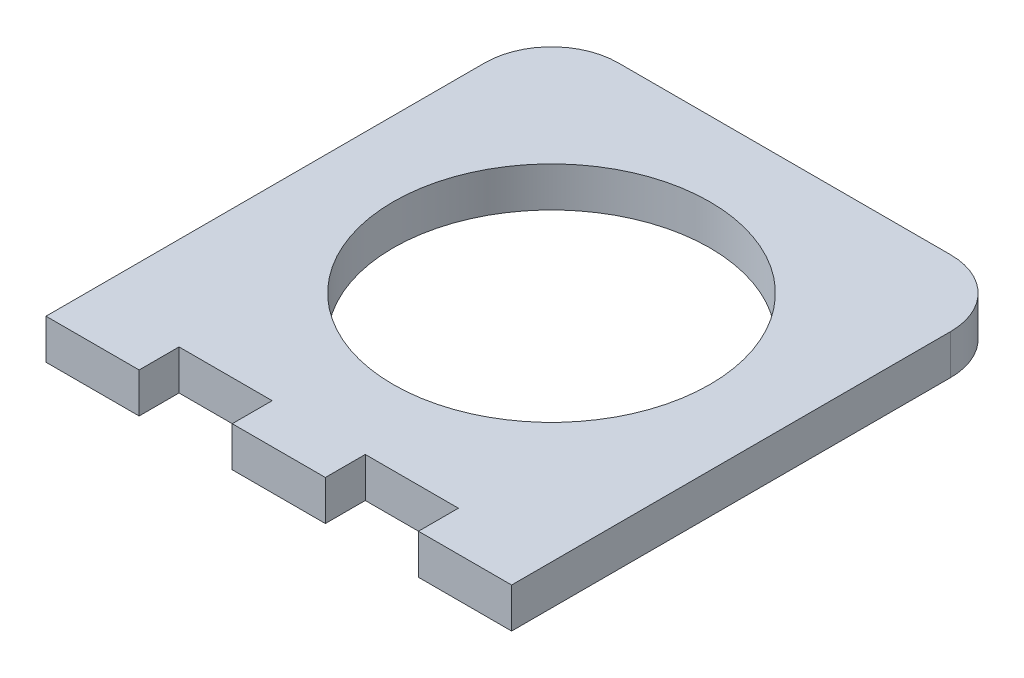
ISO-10303-21;
HEADER;
FILE_DESCRIPTION(('STEP AP214'),'2;1');
FILE_NAME('part.step','',(''),(''),'','','');
FILE_SCHEMA(('AUTOMOTIVE_DESIGN { 1 0 10303 214 1 1 1 1 }'));
ENDSEC;
DATA;
#1=APPLICATION_CONTEXT('core data for automotive mechanical design processes');
#2=APPLICATION_PROTOCOL_DEFINITION('international standard','automotive_design',2000,#1);
#3=PRODUCT_CONTEXT('',#1,'mechanical');
#4=PRODUCT('Part','Part','',(#3));
#5=PRODUCT_RELATED_PRODUCT_CATEGORY('part','',(#4));
#6=PRODUCT_DEFINITION_FORMATION('','',#4);
#7=PRODUCT_DEFINITION_CONTEXT('part definition',#1,'design');
#8=PRODUCT_DEFINITION('design','',#6,#7);
#9=PRODUCT_DEFINITION_SHAPE('','',#8);
#10=(LENGTH_UNIT() NAMED_UNIT(*) SI_UNIT(.MILLI.,.METRE.));
#11=(NAMED_UNIT(*) PLANE_ANGLE_UNIT() SI_UNIT($,.RADIAN.));
#12=(NAMED_UNIT(*) SI_UNIT($,.STERADIAN.) SOLID_ANGLE_UNIT());
#13=UNCERTAINTY_MEASURE_WITH_UNIT(LENGTH_MEASURE(1.E-05),#10,'distance_accuracy_value','');
#14=(GEOMETRIC_REPRESENTATION_CONTEXT(3) GLOBAL_UNCERTAINTY_ASSIGNED_CONTEXT((#13)) GLOBAL_UNIT_ASSIGNED_CONTEXT((#10,
#11,#12)) REPRESENTATION_CONTEXT('',''));
#15=CARTESIAN_POINT('',(0.,0.,0.));
#16=DIRECTION('',(0.,0.,1.));
#17=DIRECTION('',(1.,0.,0.));
#18=AXIS2_PLACEMENT_3D('',#15,#16,#17);
#19=CARTESIAN_POINT('',(0.,3.,19.));
#20=DIRECTION('',(0.,0.,1.));
#21=DIRECTION('',(1.,0.,0.));
#22=AXIS2_PLACEMENT_3D('',#19,#20,#21);
#23=PLANE('',#22);
#24=DIRECTION('',(0.,1.,0.));
#25=VECTOR('',#24,1.);
#26=CARTESIAN_POINT('',(3.5,0.,19.));
#27=LINE('',#26,#25);
#28=CARTESIAN_POINT('',(3.5,0.,19.));
#29=VERTEX_POINT('',#28);
#30=CARTESIAN_POINT('',(3.5,3.,19.));
#31=VERTEX_POINT('',#30);
#32=EDGE_CURVE('E135',#29,#31,#27,.T.);
#33=ORIENTED_EDGE('',*,*,#32,.T.);
#34=DIRECTION('',(-1.,0.,0.));
#35=VECTOR('',#34,1.);
#36=CARTESIAN_POINT('',(0.,3.,19.));
#37=LINE('',#36,#35);
#38=CARTESIAN_POINT('',(-3.5,3.,19.));
#39=VERTEX_POINT('',#38);
#40=EDGE_CURVE('E235',#31,#39,#37,.T.);
#41=ORIENTED_EDGE('',*,*,#40,.T.);
#42=DIRECTION('',(0.,1.,0.));
#43=VECTOR('',#42,1.);
#44=CARTESIAN_POINT('',(-3.5,0.,19.));
#45=LINE('',#44,#43);
#46=CARTESIAN_POINT('',(-3.5,0.,19.));
#47=VERTEX_POINT('',#46);
#48=EDGE_CURVE('E157',#47,#39,#45,.T.);
#49=ORIENTED_EDGE('',*,*,#48,.F.);
#50=DIRECTION('',(-1.,0.,0.));
#51=VECTOR('',#50,1.);
#52=CARTESIAN_POINT('',(0.,0.,19.));
#53=LINE('',#52,#51);
#54=EDGE_CURVE('E149',#29,#47,#53,.T.);
#55=ORIENTED_EDGE('',*,*,#54,.F.);
#56=EDGE_LOOP('',(#33,#41,#49,#55));
#57=FACE_BOUND('',#56,.T.);
#58=ADVANCED_FACE('F35',(#57),#23,.T.);
#59=DIRECTION('',(0.,1.,0.));
#60=VECTOR('',#59,1.);
#61=CARTESIAN_POINT('',(-10.5,0.,19.));
#62=LINE('',#61,#60);
#63=CARTESIAN_POINT('',(-10.5,0.,19.));
#64=VERTEX_POINT('',#63);
#65=CARTESIAN_POINT('',(-10.5,3.,19.));
#66=VERTEX_POINT('',#65);
#67=EDGE_CURVE('E227',#64,#66,#62,.T.);
#68=ORIENTED_EDGE('',*,*,#67,.T.);
#69=CARTESIAN_POINT('',(-17.5,3.,19.));
#70=VERTEX_POINT('',#69);
#71=EDGE_CURVE('E231',#66,#70,#37,.T.);
#72=ORIENTED_EDGE('',*,*,#71,.T.);
#73=DIRECTION('',(0.,-1.,0.));
#74=VECTOR('',#73,1.);
#75=CARTESIAN_POINT('',(-17.5,3.,19.));
#76=LINE('',#75,#74);
#77=CARTESIAN_POINT('',(-17.5,0.,19.));
#78=VERTEX_POINT('',#77);
#79=EDGE_CURVE('E175',#70,#78,#76,.T.);
#80=ORIENTED_EDGE('',*,*,#79,.T.);
#81=EDGE_CURVE('E159',#64,#78,#53,.T.);
#82=ORIENTED_EDGE('',*,*,#81,.F.);
#83=EDGE_LOOP('',(#68,#72,#80,#82));
#84=FACE_BOUND('',#83,.T.);
#85=ADVANCED_FACE('F284',(#84),#23,.T.);
#86=CARTESIAN_POINT('',(-17.5,3.,0.));
#87=DIRECTION('',(-1.,0.,0.));
#88=DIRECTION('',(0.,0.,1.));
#89=AXIS2_PLACEMENT_3D('',#86,#87,#88);
#90=PLANE('',#89);
#91=DIRECTION('',(0.,0.,-1.));
#92=VECTOR('',#91,1.);
#93=CARTESIAN_POINT('',(-17.5,3.,0.));
#94=LINE('',#93,#92);
#95=CARTESIAN_POINT('',(-17.5,3.,-14.));
#96=VERTEX_POINT('',#95);
#97=EDGE_CURVE('E172',#70,#96,#94,.T.);
#98=ORIENTED_EDGE('',*,*,#97,.T.);
#99=DIRECTION('',(0.,-1.,0.));
#100=VECTOR('',#99,1.);
#101=CARTESIAN_POINT('',(-17.5,0.,-14.));
#102=LINE('',#101,#100);
#103=CARTESIAN_POINT('',(-17.5,0.,-14.));
#104=VERTEX_POINT('',#103);
#105=EDGE_CURVE('E188',#96,#104,#102,.T.);
#106=ORIENTED_EDGE('',*,*,#105,.T.);
#107=DIRECTION('',(0.,0.,-1.));
#108=VECTOR('',#107,1.);
#109=CARTESIAN_POINT('',(-17.5,0.,0.));
#110=LINE('',#109,#108);
#111=EDGE_CURVE('E163',#78,#104,#110,.T.);
#112=ORIENTED_EDGE('',*,*,#111,.F.);
#113=ORIENTED_EDGE('',*,*,#79,.F.);
#114=EDGE_LOOP('',(#98,#106,#112,#113));
#115=FACE_BOUND('',#114,.T.);
#116=ADVANCED_FACE('F213',(#115),#90,.T.);
#117=DIRECTION('',(0.,1.,0.));
#118=VECTOR('',#117,1.);
#119=CARTESIAN_POINT('',(10.5,0.,19.));
#120=LINE('',#119,#118);
#121=CARTESIAN_POINT('',(10.5,0.,19.));
#122=VERTEX_POINT('',#121);
#123=CARTESIAN_POINT('',(10.5,3.,19.));
#124=VERTEX_POINT('',#123);
#125=EDGE_CURVE('E144',#122,#124,#120,.T.);
#126=ORIENTED_EDGE('',*,*,#125,.F.);
#127=CARTESIAN_POINT('',(17.5,0.,19.));
#128=VERTEX_POINT('',#127);
#129=EDGE_CURVE('E158',#128,#122,#53,.T.);
#130=ORIENTED_EDGE('',*,*,#129,.F.);
#131=DIRECTION('',(0.,-1.,0.));
#132=VECTOR('',#131,1.);
#133=CARTESIAN_POINT('',(17.5,3.,19.));
#134=LINE('',#133,#132);
#135=CARTESIAN_POINT('',(17.5,3.,19.));
#136=VERTEX_POINT('',#135);
#137=EDGE_CURVE('E173',#136,#128,#134,.T.);
#138=ORIENTED_EDGE('',*,*,#137,.F.);
#139=EDGE_CURVE('E232',#136,#124,#37,.T.);
#140=ORIENTED_EDGE('',*,*,#139,.T.);
#141=EDGE_LOOP('',(#126,#130,#138,#140));
#142=FACE_BOUND('',#141,.T.);
#143=ADVANCED_FACE('F248',(#142),#23,.T.);
#144=CARTESIAN_POINT('',(17.5,3.,0.));
#145=DIRECTION('',(-1.,0.,0.));
#146=DIRECTION('',(0.,0.,1.));
#147=AXIS2_PLACEMENT_3D('',#144,#145,#146);
#148=PLANE('',#147);
#149=DIRECTION('',(0.,0.,-1.));
#150=VECTOR('',#149,1.);
#151=CARTESIAN_POINT('',(17.5,0.,0.));
#152=LINE('',#151,#150);
#153=CARTESIAN_POINT('',(17.5,0.,-14.));
#154=VERTEX_POINT('',#153);
#155=EDGE_CURVE('E162',#128,#154,#152,.T.);
#156=ORIENTED_EDGE('',*,*,#155,.T.);
#157=DIRECTION('',(0.,-1.,0.));
#158=VECTOR('',#157,1.);
#159=CARTESIAN_POINT('',(17.5,3.,-14.));
#160=LINE('',#159,#158);
#161=CARTESIAN_POINT('',(17.5,3.,-14.));
#162=VERTEX_POINT('',#161);
#163=EDGE_CURVE('E184',#154,#162,#160,.F.);
#164=ORIENTED_EDGE('',*,*,#163,.T.);
#165=DIRECTION('',(0.,0.,-1.));
#166=VECTOR('',#165,1.);
#167=CARTESIAN_POINT('',(17.5,3.,0.));
#168=LINE('',#167,#166);
#169=EDGE_CURVE('E208',#136,#162,#168,.T.);
#170=ORIENTED_EDGE('',*,*,#169,.F.);
#171=ORIENTED_EDGE('',*,*,#137,.T.);
#172=EDGE_LOOP('',(#156,#164,#170,#171));
#173=FACE_BOUND('',#172,.T.);
#174=ADVANCED_FACE('F245',(#173),#148,.F.);
#175=CARTESIAN_POINT('',(0.,3.,-19.));
#176=DIRECTION('',(0.,0.,1.));
#177=DIRECTION('',(1.,0.,0.));
#178=AXIS2_PLACEMENT_3D('',#175,#176,#177);
#179=PLANE('',#178);
#180=DIRECTION('',(-1.,0.,0.));
#181=VECTOR('',#180,1.);
#182=CARTESIAN_POINT('',(0.,0.,-19.));
#183=LINE('',#182,#181);
#184=CARTESIAN_POINT('',(12.5,0.,-19.));
#185=VERTEX_POINT('',#184);
#186=CARTESIAN_POINT('',(-12.5,0.,-19.));
#187=VERTEX_POINT('',#186);
#188=EDGE_CURVE('E169',#185,#187,#183,.T.);
#189=ORIENTED_EDGE('',*,*,#188,.T.);
#190=DIRECTION('',(0.,-1.,0.));
#191=VECTOR('',#190,1.);
#192=CARTESIAN_POINT('',(-12.5,3.,-19.));
#193=LINE('',#192,#191);
#194=CARTESIAN_POINT('',(-12.5,3.,-19.));
#195=VERTEX_POINT('',#194);
#196=EDGE_CURVE('E43',#187,#195,#193,.F.);
#197=ORIENTED_EDGE('',*,*,#196,.T.);
#198=DIRECTION('',(-1.,0.,0.));
#199=VECTOR('',#198,1.);
#200=CARTESIAN_POINT('',(0.,3.,-19.));
#201=LINE('',#200,#199);
#202=CARTESIAN_POINT('',(12.5,3.,-19.));
#203=VERTEX_POINT('',#202);
#204=EDGE_CURVE('E176',#203,#195,#201,.T.);
#205=ORIENTED_EDGE('',*,*,#204,.F.);
#206=DIRECTION('',(0.,-1.,0.));
#207=VECTOR('',#206,1.);
#208=CARTESIAN_POINT('',(12.5,3.,-19.));
#209=LINE('',#208,#207);
#210=EDGE_CURVE('E179',#203,#185,#209,.T.);
#211=ORIENTED_EDGE('',*,*,#210,.T.);
#212=EDGE_LOOP('',(#189,#197,#205,#211));
#213=FACE_BOUND('',#212,.T.);
#214=ADVANCED_FACE('F196',(#213),#179,.F.);
#215=CARTESIAN_POINT('',(0.,3.,0.));
#216=DIRECTION('',(0.,1.,0.));
#217=DIRECTION('',(0.,0.,1.));
#218=AXIS2_PLACEMENT_3D('',#215,#216,#217);
#219=PLANE('',#218);
#220=DIRECTION('',(0.,0.,1.));
#221=VECTOR('',#220,1.);
#222=CARTESIAN_POINT('',(3.5,3.,19.));
#223=LINE('',#222,#221);
#224=CARTESIAN_POINT('',(3.5,3.,16.));
#225=VERTEX_POINT('',#224);
#226=EDGE_CURVE('E140',#225,#31,#223,.T.);
#227=ORIENTED_EDGE('',*,*,#226,.F.);
#228=DIRECTION('',(-1.,0.,0.));
#229=VECTOR('',#228,1.);
#230=CARTESIAN_POINT('',(3.5,3.,16.));
#231=LINE('',#230,#229);
#232=CARTESIAN_POINT('',(10.5,3.,16.));
#233=VERTEX_POINT('',#232);
#234=EDGE_CURVE('E153',#233,#225,#231,.T.);
#235=ORIENTED_EDGE('',*,*,#234,.F.);
#236=DIRECTION('',(0.,0.,-1.));
#237=VECTOR('',#236,1.);
#238=CARTESIAN_POINT('',(10.5,3.,19.));
#239=LINE('',#238,#237);
#240=EDGE_CURVE('E254',#124,#233,#239,.T.);
#241=ORIENTED_EDGE('',*,*,#240,.F.);
#242=ORIENTED_EDGE('',*,*,#139,.F.);
#243=ORIENTED_EDGE('',*,*,#169,.T.);
#244=CARTESIAN_POINT('',(12.5,3.,-14.));
#245=DIRECTION('',(0.,1.,0.));
#246=DIRECTION('',(0.,0.,1.));
#247=AXIS2_PLACEMENT_3D('',#244,#245,#246);
#248=CIRCLE('',#247,5.);
#249=EDGE_CURVE('E186',#162,#203,#248,.T.);
#250=ORIENTED_EDGE('',*,*,#249,.T.);
#251=ORIENTED_EDGE('',*,*,#204,.T.);
#252=CARTESIAN_POINT('',(-12.5,3.,-14.));
#253=DIRECTION('',(0.,1.,0.));
#254=DIRECTION('',(0.,0.,1.));
#255=AXIS2_PLACEMENT_3D('',#252,#253,#254);
#256=CIRCLE('',#255,5.);
#257=EDGE_CURVE('E11',#195,#96,#256,.T.);
#258=ORIENTED_EDGE('',*,*,#257,.T.);
#259=ORIENTED_EDGE('',*,*,#97,.F.);
#260=ORIENTED_EDGE('',*,*,#71,.F.);
#261=DIRECTION('',(0.,0.,1.));
#262=VECTOR('',#261,1.);
#263=CARTESIAN_POINT('',(-10.5,3.,19.));
#264=LINE('',#263,#262);
#265=CARTESIAN_POINT('',(-10.5,3.,16.));
#266=VERTEX_POINT('',#265);
#267=EDGE_CURVE('E261',#266,#66,#264,.T.);
#268=ORIENTED_EDGE('',*,*,#267,.F.);
#269=DIRECTION('',(-1.,0.,0.));
#270=VECTOR('',#269,1.);
#271=CARTESIAN_POINT('',(-10.5,3.,16.));
#272=LINE('',#271,#270);
#273=CARTESIAN_POINT('',(-3.5,3.,16.));
#274=VERTEX_POINT('',#273);
#275=EDGE_CURVE('E268',#274,#266,#272,.T.);
#276=ORIENTED_EDGE('',*,*,#275,.F.);
#277=DIRECTION('',(0.,0.,-1.));
#278=VECTOR('',#277,1.);
#279=CARTESIAN_POINT('',(-3.5,3.,19.));
#280=LINE('',#279,#278);
#281=EDGE_CURVE('E272',#39,#274,#280,.T.);
#282=ORIENTED_EDGE('',*,*,#281,.F.);
#283=ORIENTED_EDGE('',*,*,#40,.F.);
#284=EDGE_LOOP('',(#227,#235,#241,#242,#243,#250,#251,#258,#259,#260,#268,#276,#282,#283));
#285=FACE_BOUND('',#284,.T.);
#286=CARTESIAN_POINT('',(0.,3.,-1.5));
#287=DIRECTION('',(0.,1.,0.));
#288=DIRECTION('',(0.,0.,1.));
#289=AXIS2_PLACEMENT_3D('',#286,#287,#288);
#290=CIRCLE('',#289,11.9);
#291=CARTESIAN_POINT('',(0.,3.,10.4));
#292=VERTEX_POINT('',#291);
#293=EDGE_CURVE('E219',#292,#292,#290,.T.);
#294=ORIENTED_EDGE('',*,*,#293,.F.);
#295=EDGE_LOOP('',(#294));
#296=FACE_BOUND('',#295,.T.);
#297=ADVANCED_FACE('F202',(#285,#296),#219,.T.);
#298=CARTESIAN_POINT('',(0.,0.,0.));
#299=DIRECTION('',(0.,1.,0.));
#300=DIRECTION('',(0.,0.,1.));
#301=AXIS2_PLACEMENT_3D('',#298,#299,#300);
#302=PLANE('',#301);
#303=CARTESIAN_POINT('',(0.,0.,-1.5));
#304=DIRECTION('',(0.,1.,0.));
#305=DIRECTION('',(0.,0.,1.));
#306=AXIS2_PLACEMENT_3D('',#303,#304,#305);
#307=CIRCLE('',#306,11.9);
#308=CARTESIAN_POINT('',(0.,0.,10.4));
#309=VERTEX_POINT('',#308);
#310=EDGE_CURVE('E217',#309,#309,#307,.T.);
#311=ORIENTED_EDGE('',*,*,#310,.T.);
#312=EDGE_LOOP('',(#311));
#313=FACE_BOUND('',#312,.T.);
#314=DIRECTION('',(-1.,0.,0.));
#315=VECTOR('',#314,1.);
#316=CARTESIAN_POINT('',(3.5,0.,16.));
#317=LINE('',#316,#315);
#318=CARTESIAN_POINT('',(10.5,0.,16.));
#319=VERTEX_POINT('',#318);
#320=CARTESIAN_POINT('',(3.5,0.,16.));
#321=VERTEX_POINT('',#320);
#322=EDGE_CURVE('E50',#319,#321,#317,.T.);
#323=ORIENTED_EDGE('',*,*,#322,.T.);
#324=DIRECTION('',(0.,0.,1.));
#325=VECTOR('',#324,1.);
#326=CARTESIAN_POINT('',(3.5,0.,19.));
#327=LINE('',#326,#325);
#328=EDGE_CURVE('E138',#321,#29,#327,.T.);
#329=ORIENTED_EDGE('',*,*,#328,.T.);
#330=ORIENTED_EDGE('',*,*,#54,.T.);
#331=DIRECTION('',(0.,0.,-1.));
#332=VECTOR('',#331,1.);
#333=CARTESIAN_POINT('',(-3.5,0.,19.));
#334=LINE('',#333,#332);
#335=CARTESIAN_POINT('',(-3.5,0.,16.));
#336=VERTEX_POINT('',#335);
#337=EDGE_CURVE('E267',#47,#336,#334,.T.);
#338=ORIENTED_EDGE('',*,*,#337,.T.);
#339=DIRECTION('',(-1.,0.,0.));
#340=VECTOR('',#339,1.);
#341=CARTESIAN_POINT('',(-10.5,0.,16.));
#342=LINE('',#341,#340);
#343=CARTESIAN_POINT('',(-10.5,0.,16.));
#344=VERTEX_POINT('',#343);
#345=EDGE_CURVE('E58',#336,#344,#342,.T.);
#346=ORIENTED_EDGE('',*,*,#345,.T.);
#347=DIRECTION('',(0.,0.,1.));
#348=VECTOR('',#347,1.);
#349=CARTESIAN_POINT('',(-10.5,0.,19.));
#350=LINE('',#349,#348);
#351=EDGE_CURVE('E265',#344,#64,#350,.T.);
#352=ORIENTED_EDGE('',*,*,#351,.T.);
#353=ORIENTED_EDGE('',*,*,#81,.T.);
#354=ORIENTED_EDGE('',*,*,#111,.T.);
#355=CARTESIAN_POINT('',(-12.5,0.,-14.));
#356=DIRECTION('',(0.,1.,0.));
#357=DIRECTION('',(0.,0.,1.));
#358=AXIS2_PLACEMENT_3D('',#355,#356,#357);
#359=CIRCLE('',#358,5.);
#360=EDGE_CURVE('E191',#104,#187,#359,.F.);
#361=ORIENTED_EDGE('',*,*,#360,.T.);
#362=ORIENTED_EDGE('',*,*,#188,.F.);
#363=CARTESIAN_POINT('',(12.5,0.,-14.));
#364=DIRECTION('',(0.,1.,0.));
#365=DIRECTION('',(0.,0.,1.));
#366=AXIS2_PLACEMENT_3D('',#363,#364,#365);
#367=CIRCLE('',#366,5.);
#368=EDGE_CURVE('E182',#185,#154,#367,.F.);
#369=ORIENTED_EDGE('',*,*,#368,.T.);
#370=ORIENTED_EDGE('',*,*,#155,.F.);
#371=ORIENTED_EDGE('',*,*,#129,.T.);
#372=DIRECTION('',(0.,0.,-1.));
#373=VECTOR('',#372,1.);
#374=CARTESIAN_POINT('',(10.5,0.,19.));
#375=LINE('',#374,#373);
#376=EDGE_CURVE('E152',#122,#319,#375,.T.);
#377=ORIENTED_EDGE('',*,*,#376,.T.);
#378=EDGE_LOOP('',(#323,#329,#330,#338,#346,#352,#353,#354,#361,#362,#369,#370,#371,#377));
#379=FACE_BOUND('',#378,.T.);
#380=ADVANCED_FACE('F147',(#313,#379),#302,.F.);
#381=CARTESIAN_POINT('',(0.,0.,-1.5));
#382=DIRECTION('',(0.,1.,0.));
#383=DIRECTION('',(0.,0.,1.));
#384=AXIS2_PLACEMENT_3D('',#381,#382,#383);
#385=CYLINDRICAL_SURFACE('',#384,11.9);
#386=ORIENTED_EDGE('',*,*,#310,.F.);
#387=EDGE_LOOP('',(#386));
#388=FACE_BOUND('',#387,.T.);
#389=ORIENTED_EDGE('',*,*,#293,.T.);
#390=EDGE_LOOP('',(#389));
#391=FACE_BOUND('',#390,.T.);
#392=ADVANCED_FACE('F317',(#388,#391),#385,.F.);
#393=CARTESIAN_POINT('',(12.5,3.,-14.));
#394=DIRECTION('',(0.,-1.,0.));
#395=DIRECTION('',(0.,0.,-1.));
#396=AXIS2_PLACEMENT_3D('',#393,#394,#395);
#397=CYLINDRICAL_SURFACE('',#396,5.);
#398=ORIENTED_EDGE('',*,*,#249,.F.);
#399=ORIENTED_EDGE('',*,*,#163,.F.);
#400=ORIENTED_EDGE('',*,*,#368,.F.);
#401=ORIENTED_EDGE('',*,*,#210,.F.);
#402=EDGE_LOOP('',(#398,#399,#400,#401));
#403=FACE_BOUND('',#402,.T.);
#404=ADVANCED_FACE('F242',(#403),#397,.T.);
#405=CARTESIAN_POINT('',(-12.5,3.,-14.));
#406=DIRECTION('',(0.,1.,0.));
#407=DIRECTION('',(0.,0.,1.));
#408=AXIS2_PLACEMENT_3D('',#405,#406,#407);
#409=CYLINDRICAL_SURFACE('',#408,5.);
#410=ORIENTED_EDGE('',*,*,#257,.F.);
#411=ORIENTED_EDGE('',*,*,#196,.F.);
#412=ORIENTED_EDGE('',*,*,#360,.F.);
#413=ORIENTED_EDGE('',*,*,#105,.F.);
#414=EDGE_LOOP('',(#410,#411,#412,#413));
#415=FACE_BOUND('',#414,.T.);
#416=ADVANCED_FACE('F37',(#415),#409,.T.);
#417=CARTESIAN_POINT('',(-10.5,0.,19.));
#418=DIRECTION('',(-1.,0.,0.));
#419=DIRECTION('',(0.,0.,1.));
#420=AXIS2_PLACEMENT_3D('',#417,#418,#419);
#421=PLANE('',#420);
#422=ORIENTED_EDGE('',*,*,#267,.T.);
#423=ORIENTED_EDGE('',*,*,#67,.F.);
#424=ORIENTED_EDGE('',*,*,#351,.F.);
#425=DIRECTION('',(0.,1.,0.));
#426=VECTOR('',#425,1.);
#427=CARTESIAN_POINT('',(-10.5,0.,16.));
#428=LINE('',#427,#426);
#429=EDGE_CURVE('E224',#344,#266,#428,.T.);
#430=ORIENTED_EDGE('',*,*,#429,.T.);
#431=EDGE_LOOP('',(#422,#423,#424,#430));
#432=FACE_BOUND('',#431,.T.);
#433=ADVANCED_FACE('F291',(#432),#421,.F.);
#434=CARTESIAN_POINT('',(-10.5,0.,16.));
#435=DIRECTION('',(0.,0.,-1.));
#436=DIRECTION('',(-1.,0.,0.));
#437=AXIS2_PLACEMENT_3D('',#434,#435,#436);
#438=PLANE('',#437);
#439=ORIENTED_EDGE('',*,*,#275,.T.);
#440=ORIENTED_EDGE('',*,*,#429,.F.);
#441=ORIENTED_EDGE('',*,*,#345,.F.);
#442=DIRECTION('',(0.,1.,0.));
#443=VECTOR('',#442,1.);
#444=CARTESIAN_POINT('',(-3.5,0.,16.));
#445=LINE('',#444,#443);
#446=EDGE_CURVE('E278',#336,#274,#445,.T.);
#447=ORIENTED_EDGE('',*,*,#446,.T.);
#448=EDGE_LOOP('',(#439,#440,#441,#447));
#449=FACE_BOUND('',#448,.T.);
#450=ADVANCED_FACE('F292',(#449),#438,.F.);
#451=CARTESIAN_POINT('',(-3.5,0.,19.));
#452=DIRECTION('',(1.,0.,0.));
#453=DIRECTION('',(0.,0.,-1.));
#454=AXIS2_PLACEMENT_3D('',#451,#452,#453);
#455=PLANE('',#454);
#456=ORIENTED_EDGE('',*,*,#281,.T.);
#457=ORIENTED_EDGE('',*,*,#446,.F.);
#458=ORIENTED_EDGE('',*,*,#337,.F.);
#459=ORIENTED_EDGE('',*,*,#48,.T.);
#460=EDGE_LOOP('',(#456,#457,#458,#459));
#461=FACE_BOUND('',#460,.T.);
#462=ADVANCED_FACE('F290',(#461),#455,.F.);
#463=CARTESIAN_POINT('',(3.5,0.,19.));
#464=DIRECTION('',(-1.,0.,0.));
#465=DIRECTION('',(0.,0.,1.));
#466=AXIS2_PLACEMENT_3D('',#463,#464,#465);
#467=PLANE('',#466);
#468=ORIENTED_EDGE('',*,*,#226,.T.);
#469=ORIENTED_EDGE('',*,*,#32,.F.);
#470=ORIENTED_EDGE('',*,*,#328,.F.);
#471=DIRECTION('',(0.,1.,0.));
#472=VECTOR('',#471,1.);
#473=CARTESIAN_POINT('',(3.5,0.,16.));
#474=LINE('',#473,#472);
#475=EDGE_CURVE('E259',#321,#225,#474,.T.);
#476=ORIENTED_EDGE('',*,*,#475,.T.);
#477=EDGE_LOOP('',(#468,#469,#470,#476));
#478=FACE_BOUND('',#477,.T.);
#479=ADVANCED_FACE('F137',(#478),#467,.F.);
#480=CARTESIAN_POINT('',(3.5,0.,16.));
#481=DIRECTION('',(0.,0.,-1.));
#482=DIRECTION('',(-1.,0.,0.));
#483=AXIS2_PLACEMENT_3D('',#480,#481,#482);
#484=PLANE('',#483);
#485=ORIENTED_EDGE('',*,*,#234,.T.);
#486=ORIENTED_EDGE('',*,*,#475,.F.);
#487=ORIENTED_EDGE('',*,*,#322,.F.);
#488=DIRECTION('',(0.,1.,0.));
#489=VECTOR('',#488,1.);
#490=CARTESIAN_POINT('',(10.5,0.,16.));
#491=LINE('',#490,#489);
#492=EDGE_CURVE('E262',#319,#233,#491,.T.);
#493=ORIENTED_EDGE('',*,*,#492,.T.);
#494=EDGE_LOOP('',(#485,#486,#487,#493));
#495=FACE_BOUND('',#494,.T.);
#496=ADVANCED_FACE('F356',(#495),#484,.F.);
#497=CARTESIAN_POINT('',(10.5,0.,19.));
#498=DIRECTION('',(1.,0.,0.));
#499=DIRECTION('',(0.,0.,-1.));
#500=AXIS2_PLACEMENT_3D('',#497,#498,#499);
#501=PLANE('',#500);
#502=ORIENTED_EDGE('',*,*,#240,.T.);
#503=ORIENTED_EDGE('',*,*,#492,.F.);
#504=ORIENTED_EDGE('',*,*,#376,.F.);
#505=ORIENTED_EDGE('',*,*,#125,.T.);
#506=EDGE_LOOP('',(#502,#503,#504,#505));
#507=FACE_BOUND('',#506,.T.);
#508=ADVANCED_FACE('F365',(#507),#501,.F.);
#509=CLOSED_SHELL('',(#58,#85,#116,#143,#174,#214,#297,#380,#392,#404,#416,#433,#450,#462,#479,
#496,#508));
#510=MANIFOLD_SOLID_BREP('B2',#509);
#511=ADVANCED_BREP_SHAPE_REPRESENTATION('',(#18,#510),#14);
#512=SHAPE_DEFINITION_REPRESENTATION(#9,#511);
ENDSEC;
END-ISO-10303-21;
